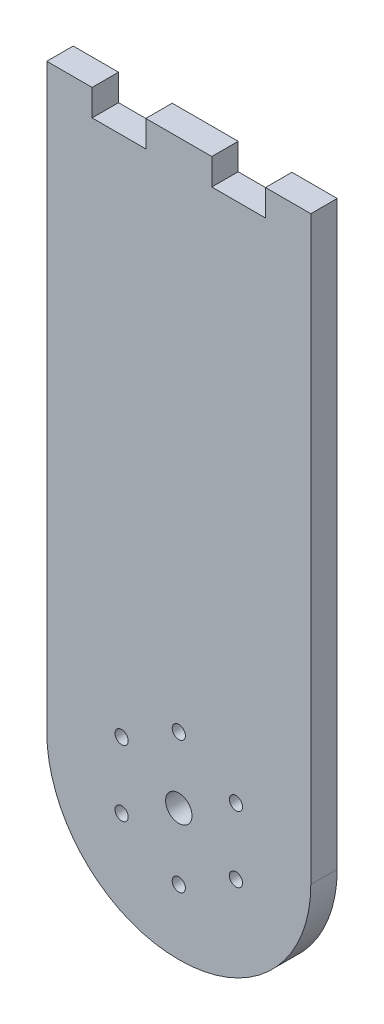
ISO-10303-21;
HEADER;
FILE_DESCRIPTION(('STEP AP214'),'2;1');
FILE_NAME('part.step','',(''),(''),'','','');
FILE_SCHEMA(('AUTOMOTIVE_DESIGN { 1 0 10303 214 1 1 1 1 }'));
ENDSEC;
DATA;
#1=APPLICATION_CONTEXT('core data for automotive mechanical design processes');
#2=APPLICATION_PROTOCOL_DEFINITION('international standard','automotive_design',2000,#1);
#3=PRODUCT_CONTEXT('',#1,'mechanical');
#4=PRODUCT('Part','Part','',(#3));
#5=PRODUCT_RELATED_PRODUCT_CATEGORY('part','',(#4));
#6=PRODUCT_DEFINITION_FORMATION('','',#4);
#7=PRODUCT_DEFINITION_CONTEXT('part definition',#1,'design');
#8=PRODUCT_DEFINITION('design','',#6,#7);
#9=PRODUCT_DEFINITION_SHAPE('','',#8);
#10=(LENGTH_UNIT() NAMED_UNIT(*) SI_UNIT(.MILLI.,.METRE.));
#11=(NAMED_UNIT(*) PLANE_ANGLE_UNIT() SI_UNIT($,.RADIAN.));
#12=(NAMED_UNIT(*) SI_UNIT($,.STERADIAN.) SOLID_ANGLE_UNIT());
#13=UNCERTAINTY_MEASURE_WITH_UNIT(LENGTH_MEASURE(1.E-05),#10,'distance_accuracy_value','');
#14=(GEOMETRIC_REPRESENTATION_CONTEXT(3) GLOBAL_UNCERTAINTY_ASSIGNED_CONTEXT((#13)) GLOBAL_UNIT_ASSIGNED_CONTEXT((#10,
#11,#12)) REPRESENTATION_CONTEXT('',''));
#15=CARTESIAN_POINT('',(0.,0.,0.));
#16=DIRECTION('',(0.,0.,1.));
#17=DIRECTION('',(1.,0.,0.));
#18=AXIS2_PLACEMENT_3D('',#15,#16,#17);
#19=CARTESIAN_POINT('',(-0.0999999999999989,-25.55,3.));
#20=DIRECTION('',(0.,0.,1.));
#21=DIRECTION('',(1.,0.,0.));
#22=AXIS2_PLACEMENT_3D('',#19,#20,#21);
#23=PLANE('',#22);
#24=CARTESIAN_POINT('',(-6.49519052838329,-29.3,3.));
#25=DIRECTION('',(0.,0.,1.));
#26=DIRECTION('',(1.,0.,0.));
#27=AXIS2_PLACEMENT_3D('',#24,#25,#26);
#28=CIRCLE('',#27,0.750000000000064);
#29=CARTESIAN_POINT('',(-5.74519052838322,-29.3,3.));
#30=VERTEX_POINT('',#29);
#31=EDGE_CURVE('E329',#30,#30,#28,.T.);
#32=ORIENTED_EDGE('',*,*,#31,.F.);
#33=EDGE_LOOP('',(#32));
#34=FACE_BOUND('',#33,.T.);
#35=CARTESIAN_POINT('',(6.4951905283833,-29.3,3.));
#36=DIRECTION('',(0.,0.,1.));
#37=DIRECTION('',(1.,0.,0.));
#38=AXIS2_PLACEMENT_3D('',#35,#36,#37);
#39=CIRCLE('',#38,0.750000000000063);
#40=CARTESIAN_POINT('',(7.24519052838336,-29.3,3.));
#41=VERTEX_POINT('',#40);
#42=EDGE_CURVE('E341',#41,#41,#39,.T.);
#43=ORIENTED_EDGE('',*,*,#42,.F.);
#44=EDGE_LOOP('',(#43));
#45=FACE_BOUND('',#44,.T.);
#46=CARTESIAN_POINT('',(0.,-25.55,3.));
#47=DIRECTION('',(0.,0.,1.));
#48=DIRECTION('',(1.,0.,0.));
#49=AXIS2_PLACEMENT_3D('',#46,#47,#48);
#50=CIRCLE('',#49,1.5);
#51=CARTESIAN_POINT('',(1.5,-25.55,3.));
#52=VERTEX_POINT('',#51);
#53=EDGE_CURVE('E353',#52,#52,#50,.T.);
#54=ORIENTED_EDGE('',*,*,#53,.F.);
#55=EDGE_LOOP('',(#54));
#56=FACE_BOUND('',#55,.T.);
#57=DIRECTION('',(0.,-1.,0.));
#58=VECTOR('',#57,1.);
#59=CARTESIAN_POINT('',(-15.,40.45,3.));
#60=LINE('',#59,#58);
#61=CARTESIAN_POINT('',(-15.,40.45,3.));
#62=VERTEX_POINT('',#61);
#63=CARTESIAN_POINT('',(-15.,-25.55,3.));
#64=VERTEX_POINT('',#63);
#65=EDGE_CURVE('E193',#62,#64,#60,.T.);
#66=ORIENTED_EDGE('',*,*,#65,.T.);
#67=CARTESIAN_POINT('',(-0.0999999999999989,-25.55,3.));
#68=DIRECTION('',(0.,0.,1.));
#69=DIRECTION('',(1.,0.,0.));
#70=AXIS2_PLACEMENT_3D('',#67,#68,#69);
#71=CIRCLE('',#70,14.9);
#72=CARTESIAN_POINT('',(-0.0999999999999989,-40.45,3.));
#73=VERTEX_POINT('',#72);
#74=EDGE_CURVE('E111',#64,#73,#71,.T.);
#75=ORIENTED_EDGE('',*,*,#74,.T.);
#76=DIRECTION('',(1.,0.,0.));
#77=VECTOR('',#76,1.);
#78=CARTESIAN_POINT('',(-0.0999999999999989,-40.45,3.));
#79=LINE('',#78,#77);
#80=CARTESIAN_POINT('',(0.0999999999999968,-40.45,3.));
#81=VERTEX_POINT('',#80);
#82=EDGE_CURVE('E226',#73,#81,#79,.T.);
#83=ORIENTED_EDGE('',*,*,#82,.T.);
#84=CARTESIAN_POINT('',(0.0999999999999995,-25.55,3.));
#85=DIRECTION('',(0.,0.,1.));
#86=DIRECTION('',(1.,0.,0.));
#87=AXIS2_PLACEMENT_3D('',#84,#85,#86);
#88=CIRCLE('',#87,14.9);
#89=CARTESIAN_POINT('',(15.,-25.55,3.));
#90=VERTEX_POINT('',#89);
#91=EDGE_CURVE('E245',#81,#90,#88,.T.);
#92=ORIENTED_EDGE('',*,*,#91,.T.);
#93=DIRECTION('',(0.,1.,0.));
#94=VECTOR('',#93,1.);
#95=CARTESIAN_POINT('',(15.,40.45,3.));
#96=LINE('',#95,#94);
#97=CARTESIAN_POINT('',(15.,40.45,3.));
#98=VERTEX_POINT('',#97);
#99=EDGE_CURVE('E242',#90,#98,#96,.T.);
#100=ORIENTED_EDGE('',*,*,#99,.T.);
#101=DIRECTION('',(-1.,0.,0.));
#102=VECTOR('',#101,1.);
#103=CARTESIAN_POINT('',(9.84999999999998,40.45,3.));
#104=LINE('',#103,#102);
#105=CARTESIAN_POINT('',(9.84999999999998,40.45,3.));
#106=VERTEX_POINT('',#105);
#107=EDGE_CURVE('E244',#98,#106,#104,.T.);
#108=ORIENTED_EDGE('',*,*,#107,.T.);
#109=DIRECTION('',(0.,-1.,0.));
#110=VECTOR('',#109,1.);
#111=CARTESIAN_POINT('',(9.84999999999998,37.45,3.));
#112=LINE('',#111,#110);
#113=CARTESIAN_POINT('',(9.84999999999998,37.45,3.));
#114=VERTEX_POINT('',#113);
#115=EDGE_CURVE('E247',#106,#114,#112,.T.);
#116=ORIENTED_EDGE('',*,*,#115,.T.);
#117=DIRECTION('',(-1.,0.,0.));
#118=VECTOR('',#117,1.);
#119=CARTESIAN_POINT('',(3.75,37.45,3.));
#120=LINE('',#119,#118);
#121=CARTESIAN_POINT('',(3.75,37.45,3.));
#122=VERTEX_POINT('',#121);
#123=EDGE_CURVE('E253',#114,#122,#120,.T.);
#124=ORIENTED_EDGE('',*,*,#123,.T.);
#125=DIRECTION('',(0.,1.,0.));
#126=VECTOR('',#125,1.);
#127=CARTESIAN_POINT('',(3.75,40.45,3.));
#128=LINE('',#127,#126);
#129=CARTESIAN_POINT('',(3.75,40.45,3.));
#130=VERTEX_POINT('',#129);
#131=EDGE_CURVE('E255',#122,#130,#128,.T.);
#132=ORIENTED_EDGE('',*,*,#131,.T.);
#133=DIRECTION('',(-1.,0.,0.));
#134=VECTOR('',#133,1.);
#135=CARTESIAN_POINT('',(-3.75,40.45,3.));
#136=LINE('',#135,#134);
#137=CARTESIAN_POINT('',(-3.75,40.45,3.));
#138=VERTEX_POINT('',#137);
#139=EDGE_CURVE('E257',#130,#138,#136,.T.);
#140=ORIENTED_EDGE('',*,*,#139,.T.);
#141=DIRECTION('',(0.,-1.,0.));
#142=VECTOR('',#141,1.);
#143=CARTESIAN_POINT('',(-3.75,37.45,3.));
#144=LINE('',#143,#142);
#145=CARTESIAN_POINT('',(-3.75,37.45,3.));
#146=VERTEX_POINT('',#145);
#147=EDGE_CURVE('E148',#138,#146,#144,.T.);
#148=ORIENTED_EDGE('',*,*,#147,.T.);
#149=DIRECTION('',(-1.,0.,0.));
#150=VECTOR('',#149,1.);
#151=CARTESIAN_POINT('',(-9.85000000000002,37.45,3.));
#152=LINE('',#151,#150);
#153=CARTESIAN_POINT('',(-9.85000000000002,37.45,3.));
#154=VERTEX_POINT('',#153);
#155=EDGE_CURVE('E142',#146,#154,#152,.T.);
#156=ORIENTED_EDGE('',*,*,#155,.T.);
#157=DIRECTION('',(0.,1.,0.));
#158=VECTOR('',#157,1.);
#159=CARTESIAN_POINT('',(-9.85000000000002,40.45,3.));
#160=LINE('',#159,#158);
#161=CARTESIAN_POINT('',(-9.85000000000002,40.45,3.));
#162=VERTEX_POINT('',#161);
#163=EDGE_CURVE('E146',#154,#162,#160,.T.);
#164=ORIENTED_EDGE('',*,*,#163,.T.);
#165=DIRECTION('',(-1.,0.,0.));
#166=VECTOR('',#165,1.);
#167=CARTESIAN_POINT('',(-15.,40.45,3.));
#168=LINE('',#167,#166);
#169=EDGE_CURVE('E50',#162,#62,#168,.T.);
#170=ORIENTED_EDGE('',*,*,#169,.T.);
#171=EDGE_LOOP('',(#66,#75,#83,#92,#100,#108,#116,#124,#132,#140,#148,#156,#164,#170));
#172=FACE_BOUND('',#171,.T.);
#173=CARTESIAN_POINT('',(0.,-18.05,3.));
#174=DIRECTION('',(0.,0.,1.));
#175=DIRECTION('',(1.,0.,0.));
#176=AXIS2_PLACEMENT_3D('',#173,#174,#175);
#177=CIRCLE('',#176,0.750000000000086);
#178=CARTESIAN_POINT('',(0.750000000000088,-18.05,3.));
#179=VERTEX_POINT('',#178);
#180=EDGE_CURVE('E170',#179,#179,#177,.T.);
#181=ORIENTED_EDGE('',*,*,#180,.F.);
#182=EDGE_LOOP('',(#181));
#183=FACE_BOUND('',#182,.T.);
#184=CARTESIAN_POINT('',(6.49519052838329,-21.8,3.));
#185=DIRECTION('',(0.,0.,1.));
#186=DIRECTION('',(1.,0.,0.));
#187=AXIS2_PLACEMENT_3D('',#184,#185,#186);
#188=CIRCLE('',#187,0.750000000000062);
#189=CARTESIAN_POINT('',(7.24519052838335,-21.8,3.));
#190=VERTEX_POINT('',#189);
#191=EDGE_CURVE('E347',#190,#190,#188,.T.);
#192=ORIENTED_EDGE('',*,*,#191,.F.);
#193=EDGE_LOOP('',(#192));
#194=FACE_BOUND('',#193,.T.);
#195=CARTESIAN_POINT('',(0.,-33.05,3.));
#196=DIRECTION('',(0.,0.,1.));
#197=DIRECTION('',(1.,0.,0.));
#198=AXIS2_PLACEMENT_3D('',#195,#196,#197);
#199=CIRCLE('',#198,0.750000000000066);
#200=CARTESIAN_POINT('',(0.75000000000009,-33.05,3.));
#201=VERTEX_POINT('',#200);
#202=EDGE_CURVE('E335',#201,#201,#199,.T.);
#203=ORIENTED_EDGE('',*,*,#202,.F.);
#204=EDGE_LOOP('',(#203));
#205=FACE_BOUND('',#204,.T.);
#206=CARTESIAN_POINT('',(-6.49519052838329,-21.8,3.));
#207=DIRECTION('',(0.,0.,1.));
#208=DIRECTION('',(1.,0.,0.));
#209=AXIS2_PLACEMENT_3D('',#206,#207,#208);
#210=CIRCLE('',#209,0.750000000000064);
#211=CARTESIAN_POINT('',(-5.74519052838323,-21.8,3.));
#212=VERTEX_POINT('',#211);
#213=EDGE_CURVE('E320',#212,#212,#210,.T.);
#214=ORIENTED_EDGE('',*,*,#213,.F.);
#215=EDGE_LOOP('',(#214));
#216=FACE_BOUND('',#215,.T.);
#217=ADVANCED_FACE('F33',(#34,#45,#56,#172,#183,#194,#205,#216),#23,.T.);
#218=CARTESIAN_POINT('',(-0.0999999999999989,-25.55,0.));
#219=DIRECTION('',(0.,0.,1.));
#220=DIRECTION('',(1.,0.,0.));
#221=AXIS2_PLACEMENT_3D('',#218,#219,#220);
#222=PLANE('',#221);
#223=DIRECTION('',(0.,-1.,0.));
#224=VECTOR('',#223,1.);
#225=CARTESIAN_POINT('',(-15.,40.45,0.));
#226=LINE('',#225,#224);
#227=CARTESIAN_POINT('',(-15.,40.45,0.));
#228=VERTEX_POINT('',#227);
#229=CARTESIAN_POINT('',(-15.,-25.55,0.));
#230=VERTEX_POINT('',#229);
#231=EDGE_CURVE('E166',#228,#230,#226,.T.);
#232=ORIENTED_EDGE('',*,*,#231,.F.);
#233=DIRECTION('',(-1.,0.,0.));
#234=VECTOR('',#233,1.);
#235=CARTESIAN_POINT('',(-15.,40.45,0.));
#236=LINE('',#235,#234);
#237=CARTESIAN_POINT('',(-9.85000000000002,40.45,0.));
#238=VERTEX_POINT('',#237);
#239=EDGE_CURVE('E103',#238,#228,#236,.T.);
#240=ORIENTED_EDGE('',*,*,#239,.F.);
#241=DIRECTION('',(0.,1.,0.));
#242=VECTOR('',#241,1.);
#243=CARTESIAN_POINT('',(-9.85000000000002,40.45,0.));
#244=LINE('',#243,#242);
#245=CARTESIAN_POINT('',(-9.85000000000002,37.45,0.));
#246=VERTEX_POINT('',#245);
#247=EDGE_CURVE('E97',#246,#238,#244,.T.);
#248=ORIENTED_EDGE('',*,*,#247,.F.);
#249=DIRECTION('',(-1.,0.,0.));
#250=VECTOR('',#249,1.);
#251=CARTESIAN_POINT('',(-9.85000000000002,37.45,0.));
#252=LINE('',#251,#250);
#253=CARTESIAN_POINT('',(-3.75,37.45,0.));
#254=VERTEX_POINT('',#253);
#255=EDGE_CURVE('E156',#254,#246,#252,.T.);
#256=ORIENTED_EDGE('',*,*,#255,.F.);
#257=DIRECTION('',(0.,-1.,0.));
#258=VECTOR('',#257,1.);
#259=CARTESIAN_POINT('',(-3.75,37.45,0.));
#260=LINE('',#259,#258);
#261=CARTESIAN_POINT('',(-3.75,40.45,0.));
#262=VERTEX_POINT('',#261);
#263=EDGE_CURVE('E188',#262,#254,#260,.T.);
#264=ORIENTED_EDGE('',*,*,#263,.F.);
#265=DIRECTION('',(-1.,0.,0.));
#266=VECTOR('',#265,1.);
#267=CARTESIAN_POINT('',(-3.75,40.45,0.));
#268=LINE('',#267,#266);
#269=CARTESIAN_POINT('',(3.75,40.45,0.));
#270=VERTEX_POINT('',#269);
#271=EDGE_CURVE('E186',#270,#262,#268,.T.);
#272=ORIENTED_EDGE('',*,*,#271,.F.);
#273=DIRECTION('',(0.,1.,0.));
#274=VECTOR('',#273,1.);
#275=CARTESIAN_POINT('',(3.75,40.45,0.));
#276=LINE('',#275,#274);
#277=CARTESIAN_POINT('',(3.75,37.45,0.));
#278=VERTEX_POINT('',#277);
#279=EDGE_CURVE('E184',#278,#270,#276,.T.);
#280=ORIENTED_EDGE('',*,*,#279,.F.);
#281=DIRECTION('',(-1.,0.,0.));
#282=VECTOR('',#281,1.);
#283=CARTESIAN_POINT('',(3.75,37.45,0.));
#284=LINE('',#283,#282);
#285=CARTESIAN_POINT('',(9.84999999999998,37.45,0.));
#286=VERTEX_POINT('',#285);
#287=EDGE_CURVE('E182',#286,#278,#284,.T.);
#288=ORIENTED_EDGE('',*,*,#287,.F.);
#289=DIRECTION('',(0.,-1.,0.));
#290=VECTOR('',#289,1.);
#291=CARTESIAN_POINT('',(9.84999999999998,37.45,0.));
#292=LINE('',#291,#290);
#293=CARTESIAN_POINT('',(9.84999999999998,40.45,0.));
#294=VERTEX_POINT('',#293);
#295=EDGE_CURVE('E180',#294,#286,#292,.T.);
#296=ORIENTED_EDGE('',*,*,#295,.F.);
#297=DIRECTION('',(-1.,0.,0.));
#298=VECTOR('',#297,1.);
#299=CARTESIAN_POINT('',(9.84999999999998,40.45,0.));
#300=LINE('',#299,#298);
#301=CARTESIAN_POINT('',(15.,40.45,0.));
#302=VERTEX_POINT('',#301);
#303=EDGE_CURVE('E178',#302,#294,#300,.T.);
#304=ORIENTED_EDGE('',*,*,#303,.F.);
#305=DIRECTION('',(0.,1.,0.));
#306=VECTOR('',#305,1.);
#307=CARTESIAN_POINT('',(15.,40.45,0.));
#308=LINE('',#307,#306);
#309=CARTESIAN_POINT('',(15.,-25.55,0.));
#310=VERTEX_POINT('',#309);
#311=EDGE_CURVE('E176',#310,#302,#308,.T.);
#312=ORIENTED_EDGE('',*,*,#311,.F.);
#313=CARTESIAN_POINT('',(0.0999999999999995,-25.55,0.));
#314=DIRECTION('',(0.,0.,1.));
#315=DIRECTION('',(1.,0.,0.));
#316=AXIS2_PLACEMENT_3D('',#313,#314,#315);
#317=CIRCLE('',#316,14.9);
#318=CARTESIAN_POINT('',(0.0999999999999968,-40.45,0.));
#319=VERTEX_POINT('',#318);
#320=EDGE_CURVE('E174',#319,#310,#317,.T.);
#321=ORIENTED_EDGE('',*,*,#320,.F.);
#322=DIRECTION('',(1.,0.,0.));
#323=VECTOR('',#322,1.);
#324=CARTESIAN_POINT('',(-0.0999999999999989,-40.45,0.));
#325=LINE('',#324,#323);
#326=CARTESIAN_POINT('',(-0.0999999999999989,-40.45,0.));
#327=VERTEX_POINT('',#326);
#328=EDGE_CURVE('E172',#327,#319,#325,.T.);
#329=ORIENTED_EDGE('',*,*,#328,.F.);
#330=CARTESIAN_POINT('',(-0.0999999999999989,-25.55,0.));
#331=DIRECTION('',(0.,0.,1.));
#332=DIRECTION('',(1.,0.,0.));
#333=AXIS2_PLACEMENT_3D('',#330,#331,#332);
#334=CIRCLE('',#333,14.9);
#335=EDGE_CURVE('E169',#230,#327,#334,.T.);
#336=ORIENTED_EDGE('',*,*,#335,.F.);
#337=EDGE_LOOP('',(#232,#240,#248,#256,#264,#272,#280,#288,#296,#304,#312,#321,#329,#336));
#338=FACE_BOUND('',#337,.T.);
#339=CARTESIAN_POINT('',(0.,-18.05,0.));
#340=DIRECTION('',(0.,0.,1.));
#341=DIRECTION('',(1.,0.,0.));
#342=AXIS2_PLACEMENT_3D('',#339,#340,#341);
#343=CIRCLE('',#342,0.750000000000086);
#344=CARTESIAN_POINT('',(0.750000000000088,-18.05,0.));
#345=VERTEX_POINT('',#344);
#346=EDGE_CURVE('E356',#345,#345,#343,.T.);
#347=ORIENTED_EDGE('',*,*,#346,.T.);
#348=EDGE_LOOP('',(#347));
#349=FACE_BOUND('',#348,.T.);
#350=CARTESIAN_POINT('',(0.,-25.55,0.));
#351=DIRECTION('',(0.,0.,1.));
#352=DIRECTION('',(1.,0.,0.));
#353=AXIS2_PLACEMENT_3D('',#350,#351,#352);
#354=CIRCLE('',#353,1.5);
#355=CARTESIAN_POINT('',(1.5,-25.55,0.));
#356=VERTEX_POINT('',#355);
#357=EDGE_CURVE('E350',#356,#356,#354,.T.);
#358=ORIENTED_EDGE('',*,*,#357,.T.);
#359=EDGE_LOOP('',(#358));
#360=FACE_BOUND('',#359,.T.);
#361=CARTESIAN_POINT('',(6.49519052838329,-21.8,0.));
#362=DIRECTION('',(0.,0.,1.));
#363=DIRECTION('',(1.,0.,0.));
#364=AXIS2_PLACEMENT_3D('',#361,#362,#363);
#365=CIRCLE('',#364,0.750000000000062);
#366=CARTESIAN_POINT('',(7.24519052838335,-21.8,0.));
#367=VERTEX_POINT('',#366);
#368=EDGE_CURVE('E344',#367,#367,#365,.T.);
#369=ORIENTED_EDGE('',*,*,#368,.T.);
#370=EDGE_LOOP('',(#369));
#371=FACE_BOUND('',#370,.T.);
#372=CARTESIAN_POINT('',(6.4951905283833,-29.3,0.));
#373=DIRECTION('',(0.,0.,1.));
#374=DIRECTION('',(1.,0.,0.));
#375=AXIS2_PLACEMENT_3D('',#372,#373,#374);
#376=CIRCLE('',#375,0.750000000000063);
#377=CARTESIAN_POINT('',(7.24519052838336,-29.3,0.));
#378=VERTEX_POINT('',#377);
#379=EDGE_CURVE('E338',#378,#378,#376,.T.);
#380=ORIENTED_EDGE('',*,*,#379,.T.);
#381=EDGE_LOOP('',(#380));
#382=FACE_BOUND('',#381,.T.);
#383=CARTESIAN_POINT('',(0.,-33.05,0.));
#384=DIRECTION('',(0.,0.,1.));
#385=DIRECTION('',(1.,0.,0.));
#386=AXIS2_PLACEMENT_3D('',#383,#384,#385);
#387=CIRCLE('',#386,0.750000000000066);
#388=CARTESIAN_POINT('',(0.75000000000009,-33.05,0.));
#389=VERTEX_POINT('',#388);
#390=EDGE_CURVE('E332',#389,#389,#387,.T.);
#391=ORIENTED_EDGE('',*,*,#390,.T.);
#392=EDGE_LOOP('',(#391));
#393=FACE_BOUND('',#392,.T.);
#394=CARTESIAN_POINT('',(-6.49519052838329,-29.3,0.));
#395=DIRECTION('',(0.,0.,1.));
#396=DIRECTION('',(1.,0.,0.));
#397=AXIS2_PLACEMENT_3D('',#394,#395,#396);
#398=CIRCLE('',#397,0.750000000000064);
#399=CARTESIAN_POINT('',(-5.74519052838322,-29.3,0.));
#400=VERTEX_POINT('',#399);
#401=EDGE_CURVE('E326',#400,#400,#398,.T.);
#402=ORIENTED_EDGE('',*,*,#401,.T.);
#403=EDGE_LOOP('',(#402));
#404=FACE_BOUND('',#403,.T.);
#405=CARTESIAN_POINT('',(-6.49519052838329,-21.8,0.));
#406=DIRECTION('',(0.,0.,1.));
#407=DIRECTION('',(1.,0.,0.));
#408=AXIS2_PLACEMENT_3D('',#405,#406,#407);
#409=CIRCLE('',#408,0.750000000000064);
#410=CARTESIAN_POINT('',(-5.74519052838323,-21.8,0.));
#411=VERTEX_POINT('',#410);
#412=EDGE_CURVE('E323',#411,#411,#409,.T.);
#413=ORIENTED_EDGE('',*,*,#412,.T.);
#414=EDGE_LOOP('',(#413));
#415=FACE_BOUND('',#414,.T.);
#416=ADVANCED_FACE('F230',(#338,#349,#360,#371,#382,#393,#404,#415),#222,.F.);
#417=CARTESIAN_POINT('',(-15.,40.45,3.));
#418=DIRECTION('',(1.,0.,0.));
#419=DIRECTION('',(0.,0.,-1.));
#420=AXIS2_PLACEMENT_3D('',#417,#418,#419);
#421=PLANE('',#420);
#422=ORIENTED_EDGE('',*,*,#231,.T.);
#423=DIRECTION('',(0.,0.,-1.));
#424=VECTOR('',#423,1.);
#425=CARTESIAN_POINT('',(-15.,-25.55,3.));
#426=LINE('',#425,#424);
#427=EDGE_CURVE('E11',#64,#230,#426,.T.);
#428=ORIENTED_EDGE('',*,*,#427,.F.);
#429=ORIENTED_EDGE('',*,*,#65,.F.);
#430=DIRECTION('',(0.,0.,-1.));
#431=VECTOR('',#430,1.);
#432=CARTESIAN_POINT('',(-15.,40.45,3.));
#433=LINE('',#432,#431);
#434=EDGE_CURVE('E162',#62,#228,#433,.T.);
#435=ORIENTED_EDGE('',*,*,#434,.T.);
#436=EDGE_LOOP('',(#422,#428,#429,#435));
#437=FACE_BOUND('',#436,.T.);
#438=ADVANCED_FACE('F35',(#437),#421,.F.);
#439=CARTESIAN_POINT('',(-0.0999999999999989,-25.55,3.));
#440=DIRECTION('',(0.,0.,-1.));
#441=DIRECTION('',(-1.,0.,0.));
#442=AXIS2_PLACEMENT_3D('',#439,#440,#441);
#443=CYLINDRICAL_SURFACE('',#442,14.9);
#444=ORIENTED_EDGE('',*,*,#335,.T.);
#445=DIRECTION('',(0.,0.,-1.));
#446=VECTOR('',#445,1.);
#447=CARTESIAN_POINT('',(-0.0999999999999989,-40.45,3.));
#448=LINE('',#447,#446);
#449=EDGE_CURVE('E42',#73,#327,#448,.T.);
#450=ORIENTED_EDGE('',*,*,#449,.F.);
#451=ORIENTED_EDGE('',*,*,#74,.F.);
#452=ORIENTED_EDGE('',*,*,#427,.T.);
#453=EDGE_LOOP('',(#444,#450,#451,#452));
#454=FACE_BOUND('',#453,.T.);
#455=ADVANCED_FACE('F513',(#454),#443,.T.);
#456=CARTESIAN_POINT('',(-0.0999999999999989,-40.45,3.));
#457=DIRECTION('',(0.,1.,0.));
#458=DIRECTION('',(0.,0.,1.));
#459=AXIS2_PLACEMENT_3D('',#456,#457,#458);
#460=PLANE('',#459);
#461=ORIENTED_EDGE('',*,*,#328,.T.);
#462=DIRECTION('',(0.,0.,-1.));
#463=VECTOR('',#462,1.);
#464=CARTESIAN_POINT('',(0.0999999999999968,-40.45,3.));
#465=LINE('',#464,#463);
#466=EDGE_CURVE('E218',#81,#319,#465,.T.);
#467=ORIENTED_EDGE('',*,*,#466,.F.);
#468=ORIENTED_EDGE('',*,*,#82,.F.);
#469=ORIENTED_EDGE('',*,*,#449,.T.);
#470=EDGE_LOOP('',(#461,#467,#468,#469));
#471=FACE_BOUND('',#470,.T.);
#472=ADVANCED_FACE('F224',(#471),#460,.F.);
#473=CARTESIAN_POINT('',(0.0999999999999995,-25.55,3.));
#474=DIRECTION('',(0.,0.,-1.));
#475=DIRECTION('',(-1.,0.,0.));
#476=AXIS2_PLACEMENT_3D('',#473,#474,#475);
#477=CYLINDRICAL_SURFACE('',#476,14.9);
#478=ORIENTED_EDGE('',*,*,#320,.T.);
#479=DIRECTION('',(0.,0.,-1.));
#480=VECTOR('',#479,1.);
#481=CARTESIAN_POINT('',(15.,-25.55,3.));
#482=LINE('',#481,#480);
#483=EDGE_CURVE('E215',#90,#310,#482,.T.);
#484=ORIENTED_EDGE('',*,*,#483,.F.);
#485=ORIENTED_EDGE('',*,*,#91,.F.);
#486=ORIENTED_EDGE('',*,*,#466,.T.);
#487=EDGE_LOOP('',(#478,#484,#485,#486));
#488=FACE_BOUND('',#487,.T.);
#489=ADVANCED_FACE('F236',(#488),#477,.T.);
#490=CARTESIAN_POINT('',(15.,40.45,3.));
#491=DIRECTION('',(-1.,0.,0.));
#492=DIRECTION('',(0.,0.,1.));
#493=AXIS2_PLACEMENT_3D('',#490,#491,#492);
#494=PLANE('',#493);
#495=ORIENTED_EDGE('',*,*,#311,.T.);
#496=DIRECTION('',(0.,0.,-1.));
#497=VECTOR('',#496,1.);
#498=CARTESIAN_POINT('',(15.,40.45,3.));
#499=LINE('',#498,#497);
#500=EDGE_CURVE('E212',#98,#302,#499,.T.);
#501=ORIENTED_EDGE('',*,*,#500,.F.);
#502=ORIENTED_EDGE('',*,*,#99,.F.);
#503=ORIENTED_EDGE('',*,*,#483,.T.);
#504=EDGE_LOOP('',(#495,#501,#502,#503));
#505=FACE_BOUND('',#504,.T.);
#506=ADVANCED_FACE('F240',(#505),#494,.F.);
#507=CARTESIAN_POINT('',(9.84999999999998,40.45,3.));
#508=DIRECTION('',(0.,-1.,0.));
#509=DIRECTION('',(0.,0.,-1.));
#510=AXIS2_PLACEMENT_3D('',#507,#508,#509);
#511=PLANE('',#510);
#512=ORIENTED_EDGE('',*,*,#303,.T.);
#513=DIRECTION('',(0.,0.,-1.));
#514=VECTOR('',#513,1.);
#515=CARTESIAN_POINT('',(9.84999999999998,40.45,3.));
#516=LINE('',#515,#514);
#517=EDGE_CURVE('E209',#106,#294,#516,.T.);
#518=ORIENTED_EDGE('',*,*,#517,.F.);
#519=ORIENTED_EDGE('',*,*,#107,.F.);
#520=ORIENTED_EDGE('',*,*,#500,.T.);
#521=EDGE_LOOP('',(#512,#518,#519,#520));
#522=FACE_BOUND('',#521,.T.);
#523=ADVANCED_FACE('F478',(#522),#511,.F.);
#524=CARTESIAN_POINT('',(9.84999999999998,37.45,3.));
#525=DIRECTION('',(1.,0.,0.));
#526=DIRECTION('',(0.,0.,-1.));
#527=AXIS2_PLACEMENT_3D('',#524,#525,#526);
#528=PLANE('',#527);
#529=ORIENTED_EDGE('',*,*,#295,.T.);
#530=DIRECTION('',(0.,0.,-1.));
#531=VECTOR('',#530,1.);
#532=CARTESIAN_POINT('',(9.84999999999998,37.45,3.));
#533=LINE('',#532,#531);
#534=EDGE_CURVE('E206',#114,#286,#533,.T.);
#535=ORIENTED_EDGE('',*,*,#534,.F.);
#536=ORIENTED_EDGE('',*,*,#115,.F.);
#537=ORIENTED_EDGE('',*,*,#517,.T.);
#538=EDGE_LOOP('',(#529,#535,#536,#537));
#539=FACE_BOUND('',#538,.T.);
#540=ADVANCED_FACE('F468',(#539),#528,.F.);
#541=CARTESIAN_POINT('',(3.75,37.45,3.));
#542=DIRECTION('',(0.,-1.,0.));
#543=DIRECTION('',(0.,0.,-1.));
#544=AXIS2_PLACEMENT_3D('',#541,#542,#543);
#545=PLANE('',#544);
#546=ORIENTED_EDGE('',*,*,#287,.T.);
#547=DIRECTION('',(0.,0.,-1.));
#548=VECTOR('',#547,1.);
#549=CARTESIAN_POINT('',(3.75,37.45,3.));
#550=LINE('',#549,#548);
#551=EDGE_CURVE('E203',#122,#278,#550,.T.);
#552=ORIENTED_EDGE('',*,*,#551,.F.);
#553=ORIENTED_EDGE('',*,*,#123,.F.);
#554=ORIENTED_EDGE('',*,*,#534,.T.);
#555=EDGE_LOOP('',(#546,#552,#553,#554));
#556=FACE_BOUND('',#555,.T.);
#557=ADVANCED_FACE('F458',(#556),#545,.F.);
#558=CARTESIAN_POINT('',(3.75,40.45,3.));
#559=DIRECTION('',(-1.,0.,0.));
#560=DIRECTION('',(0.,-1.,0.));
#561=AXIS2_PLACEMENT_3D('',#558,#559,#560);
#562=PLANE('',#561);
#563=ORIENTED_EDGE('',*,*,#279,.T.);
#564=DIRECTION('',(0.,0.,-1.));
#565=VECTOR('',#564,1.);
#566=CARTESIAN_POINT('',(3.75,40.45,3.));
#567=LINE('',#566,#565);
#568=EDGE_CURVE('E200',#130,#270,#567,.T.);
#569=ORIENTED_EDGE('',*,*,#568,.F.);
#570=ORIENTED_EDGE('',*,*,#131,.F.);
#571=ORIENTED_EDGE('',*,*,#551,.T.);
#572=EDGE_LOOP('',(#563,#569,#570,#571));
#573=FACE_BOUND('',#572,.T.);
#574=ADVANCED_FACE('F449',(#573),#562,.F.);
#575=CARTESIAN_POINT('',(-3.75,40.45,3.));
#576=DIRECTION('',(0.,-1.,0.));
#577=DIRECTION('',(0.,0.,-1.));
#578=AXIS2_PLACEMENT_3D('',#575,#576,#577);
#579=PLANE('',#578);
#580=ORIENTED_EDGE('',*,*,#271,.T.);
#581=DIRECTION('',(0.,0.,-1.));
#582=VECTOR('',#581,1.);
#583=CARTESIAN_POINT('',(-3.75,40.45,3.));
#584=LINE('',#583,#582);
#585=EDGE_CURVE('E197',#138,#262,#584,.T.);
#586=ORIENTED_EDGE('',*,*,#585,.F.);
#587=ORIENTED_EDGE('',*,*,#139,.F.);
#588=ORIENTED_EDGE('',*,*,#568,.T.);
#589=EDGE_LOOP('',(#580,#586,#587,#588));
#590=FACE_BOUND('',#589,.T.);
#591=ADVANCED_FACE('F263',(#590),#579,.F.);
#592=CARTESIAN_POINT('',(-3.75,37.45,3.));
#593=DIRECTION('',(1.,0.,0.));
#594=DIRECTION('',(0.,0.,-1.));
#595=AXIS2_PLACEMENT_3D('',#592,#593,#594);
#596=PLANE('',#595);
#597=ORIENTED_EDGE('',*,*,#263,.T.);
#598=DIRECTION('',(0.,0.,-1.));
#599=VECTOR('',#598,1.);
#600=CARTESIAN_POINT('',(-3.75,37.45,3.));
#601=LINE('',#600,#599);
#602=EDGE_CURVE('E157',#146,#254,#601,.T.);
#603=ORIENTED_EDGE('',*,*,#602,.F.);
#604=ORIENTED_EDGE('',*,*,#147,.F.);
#605=ORIENTED_EDGE('',*,*,#585,.T.);
#606=EDGE_LOOP('',(#597,#603,#604,#605));
#607=FACE_BOUND('',#606,.T.);
#608=ADVANCED_FACE('F267',(#607),#596,.F.);
#609=CARTESIAN_POINT('',(-9.85000000000002,37.45,3.));
#610=DIRECTION('',(0.,-1.,0.));
#611=DIRECTION('',(0.,0.,-1.));
#612=AXIS2_PLACEMENT_3D('',#609,#610,#611);
#613=PLANE('',#612);
#614=ORIENTED_EDGE('',*,*,#255,.T.);
#615=DIRECTION('',(0.,0.,-1.));
#616=VECTOR('',#615,1.);
#617=CARTESIAN_POINT('',(-9.85000000000002,37.45,3.));
#618=LINE('',#617,#616);
#619=EDGE_CURVE('E153',#154,#246,#618,.T.);
#620=ORIENTED_EDGE('',*,*,#619,.F.);
#621=ORIENTED_EDGE('',*,*,#155,.F.);
#622=ORIENTED_EDGE('',*,*,#602,.T.);
#623=EDGE_LOOP('',(#614,#620,#621,#622));
#624=FACE_BOUND('',#623,.T.);
#625=ADVANCED_FACE('F154',(#624),#613,.F.);
#626=CARTESIAN_POINT('',(-9.85000000000002,40.45,3.));
#627=DIRECTION('',(-1.,0.,0.));
#628=DIRECTION('',(0.,0.,1.));
#629=AXIS2_PLACEMENT_3D('',#626,#627,#628);
#630=PLANE('',#629);
#631=ORIENTED_EDGE('',*,*,#247,.T.);
#632=DIRECTION('',(0.,0.,-1.));
#633=VECTOR('',#632,1.);
#634=CARTESIAN_POINT('',(-9.85000000000002,40.45,3.));
#635=LINE('',#634,#633);
#636=EDGE_CURVE('E158',#162,#238,#635,.T.);
#637=ORIENTED_EDGE('',*,*,#636,.F.);
#638=ORIENTED_EDGE('',*,*,#163,.F.);
#639=ORIENTED_EDGE('',*,*,#619,.T.);
#640=EDGE_LOOP('',(#631,#637,#638,#639));
#641=FACE_BOUND('',#640,.T.);
#642=ADVANCED_FACE('F160',(#641),#630,.F.);
#643=CARTESIAN_POINT('',(-15.,40.45,3.));
#644=DIRECTION('',(0.,-1.,0.));
#645=DIRECTION('',(0.,0.,-1.));
#646=AXIS2_PLACEMENT_3D('',#643,#644,#645);
#647=PLANE('',#646);
#648=ORIENTED_EDGE('',*,*,#239,.T.);
#649=ORIENTED_EDGE('',*,*,#434,.F.);
#650=ORIENTED_EDGE('',*,*,#169,.F.);
#651=ORIENTED_EDGE('',*,*,#636,.T.);
#652=EDGE_LOOP('',(#648,#649,#650,#651));
#653=FACE_BOUND('',#652,.T.);
#654=ADVANCED_FACE('F271',(#653),#647,.F.);
#655=CARTESIAN_POINT('',(0.,-18.05,3.));
#656=DIRECTION('',(0.,0.,-1.));
#657=DIRECTION('',(-1.,0.,0.));
#658=AXIS2_PLACEMENT_3D('',#655,#656,#657);
#659=CYLINDRICAL_SURFACE('',#658,0.750000000000086);
#660=ORIENTED_EDGE('',*,*,#180,.T.);
#661=EDGE_LOOP('',(#660));
#662=FACE_BOUND('',#661,.T.);
#663=ORIENTED_EDGE('',*,*,#346,.F.);
#664=EDGE_LOOP('',(#663));
#665=FACE_BOUND('',#664,.T.);
#666=ADVANCED_FACE('F273',(#662,#665),#659,.F.);
#667=CARTESIAN_POINT('',(0.,-25.55,3.));
#668=DIRECTION('',(0.,0.,-1.));
#669=DIRECTION('',(-1.,0.,0.));
#670=AXIS2_PLACEMENT_3D('',#667,#668,#669);
#671=CYLINDRICAL_SURFACE('',#670,1.5);
#672=ORIENTED_EDGE('',*,*,#53,.T.);
#673=EDGE_LOOP('',(#672));
#674=FACE_BOUND('',#673,.T.);
#675=ORIENTED_EDGE('',*,*,#357,.F.);
#676=EDGE_LOOP('',(#675));
#677=FACE_BOUND('',#676,.T.);
#678=ADVANCED_FACE('F279',(#674,#677),#671,.F.);
#679=CARTESIAN_POINT('',(6.49519052838329,-21.8,3.));
#680=DIRECTION('',(0.,0.,-1.));
#681=DIRECTION('',(-1.,0.,0.));
#682=AXIS2_PLACEMENT_3D('',#679,#680,#681);
#683=CYLINDRICAL_SURFACE('',#682,0.750000000000062);
#684=ORIENTED_EDGE('',*,*,#191,.T.);
#685=EDGE_LOOP('',(#684));
#686=FACE_BOUND('',#685,.T.);
#687=ORIENTED_EDGE('',*,*,#368,.F.);
#688=EDGE_LOOP('',(#687));
#689=FACE_BOUND('',#688,.T.);
#690=ADVANCED_FACE('F295',(#686,#689),#683,.F.);
#691=CARTESIAN_POINT('',(6.4951905283833,-29.3,3.));
#692=DIRECTION('',(0.,0.,-1.));
#693=DIRECTION('',(-1.,0.,0.));
#694=AXIS2_PLACEMENT_3D('',#691,#692,#693);
#695=CYLINDRICAL_SURFACE('',#694,0.750000000000063);
#696=ORIENTED_EDGE('',*,*,#42,.T.);
#697=EDGE_LOOP('',(#696));
#698=FACE_BOUND('',#697,.T.);
#699=ORIENTED_EDGE('',*,*,#379,.F.);
#700=EDGE_LOOP('',(#699));
#701=FACE_BOUND('',#700,.T.);
#702=ADVANCED_FACE('F299',(#698,#701),#695,.F.);
#703=CARTESIAN_POINT('',(0.,-33.05,3.));
#704=DIRECTION('',(0.,0.,-1.));
#705=DIRECTION('',(-1.,0.,0.));
#706=AXIS2_PLACEMENT_3D('',#703,#704,#705);
#707=CYLINDRICAL_SURFACE('',#706,0.750000000000066);
#708=ORIENTED_EDGE('',*,*,#202,.T.);
#709=EDGE_LOOP('',(#708));
#710=FACE_BOUND('',#709,.T.);
#711=ORIENTED_EDGE('',*,*,#390,.F.);
#712=EDGE_LOOP('',(#711));
#713=FACE_BOUND('',#712,.T.);
#714=ADVANCED_FACE('F303',(#710,#713),#707,.F.);
#715=CARTESIAN_POINT('',(-6.49519052838329,-29.3,3.));
#716=DIRECTION('',(0.,0.,-1.));
#717=DIRECTION('',(-1.,0.,0.));
#718=AXIS2_PLACEMENT_3D('',#715,#716,#717);
#719=CYLINDRICAL_SURFACE('',#718,0.750000000000064);
#720=ORIENTED_EDGE('',*,*,#31,.T.);
#721=EDGE_LOOP('',(#720));
#722=FACE_BOUND('',#721,.T.);
#723=ORIENTED_EDGE('',*,*,#401,.F.);
#724=EDGE_LOOP('',(#723));
#725=FACE_BOUND('',#724,.T.);
#726=ADVANCED_FACE('F307',(#722,#725),#719,.F.);
#727=CARTESIAN_POINT('',(-6.49519052838329,-21.8,3.));
#728=DIRECTION('',(0.,0.,-1.));
#729=DIRECTION('',(-1.,0.,0.));
#730=AXIS2_PLACEMENT_3D('',#727,#728,#729);
#731=CYLINDRICAL_SURFACE('',#730,0.750000000000064);
#732=ORIENTED_EDGE('',*,*,#213,.T.);
#733=EDGE_LOOP('',(#732));
#734=FACE_BOUND('',#733,.T.);
#735=ORIENTED_EDGE('',*,*,#412,.F.);
#736=EDGE_LOOP('',(#735));
#737=FACE_BOUND('',#736,.T.);
#738=ADVANCED_FACE('F311',(#734,#737),#731,.F.);
#739=CLOSED_SHELL('',(#217,#416,#438,#455,#472,#489,#506,#523,#540,#557,#574,#591,#608,#625,
#642,#654,#666,#678,#690,#702,#714,#726,#738));
#740=MANIFOLD_SOLID_BREP('B2',#739);
#741=ADVANCED_BREP_SHAPE_REPRESENTATION('',(#18,#740),#14);
#742=SHAPE_DEFINITION_REPRESENTATION(#9,#741);
ENDSEC;
END-ISO-10303-21;
